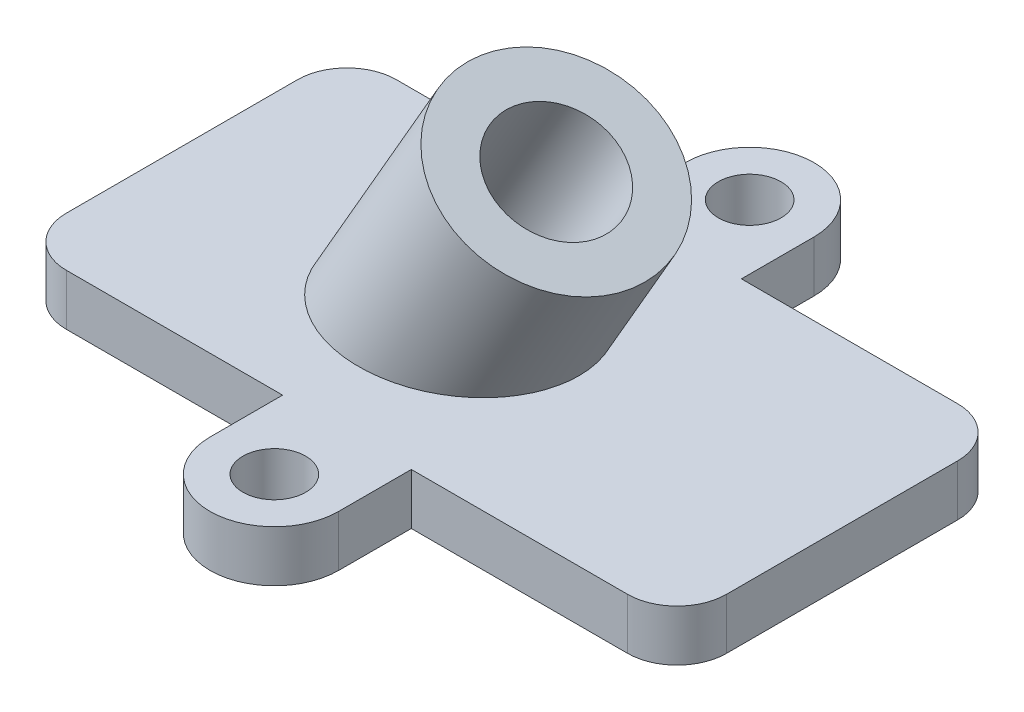
ISO-10303-21;
HEADER;
FILE_DESCRIPTION(('STEP AP214'),'2;1');
FILE_NAME('part.step','',(''),(''),'','','');
FILE_SCHEMA(('AUTOMOTIVE_DESIGN { 1 0 10303 214 1 1 1 1 }'));
ENDSEC;
DATA;
#1=APPLICATION_CONTEXT('core data for automotive mechanical design processes');
#2=APPLICATION_PROTOCOL_DEFINITION('international standard','automotive_design',2000,#1);
#3=PRODUCT_CONTEXT('',#1,'mechanical');
#4=PRODUCT('Part','Part','',(#3));
#5=PRODUCT_RELATED_PRODUCT_CATEGORY('part','',(#4));
#6=PRODUCT_DEFINITION_FORMATION('','',#4);
#7=PRODUCT_DEFINITION_CONTEXT('part definition',#1,'design');
#8=PRODUCT_DEFINITION('design','',#6,#7);
#9=PRODUCT_DEFINITION_SHAPE('','',#8);
#10=(LENGTH_UNIT() NAMED_UNIT(*) SI_UNIT(.MILLI.,.METRE.));
#11=(NAMED_UNIT(*) PLANE_ANGLE_UNIT() SI_UNIT($,.RADIAN.));
#12=(NAMED_UNIT(*) SI_UNIT($,.STERADIAN.) SOLID_ANGLE_UNIT());
#13=UNCERTAINTY_MEASURE_WITH_UNIT(LENGTH_MEASURE(1.E-05),#10,'distance_accuracy_value','');
#14=(GEOMETRIC_REPRESENTATION_CONTEXT(3) GLOBAL_UNCERTAINTY_ASSIGNED_CONTEXT((#13)) GLOBAL_UNIT_ASSIGNED_CONTEXT((#10,
#11,#12)) REPRESENTATION_CONTEXT('',''));
#15=CARTESIAN_POINT('',(0.,0.,0.));
#16=DIRECTION('',(0.,0.,1.));
#17=DIRECTION('',(1.,0.,0.));
#18=AXIS2_PLACEMENT_3D('',#15,#16,#17);
#19=CARTESIAN_POINT('',(-19.5,-15.5,50.));
#20=DIRECTION('',(-1.,0.,0.));
#21=DIRECTION('',(0.,0.,1.));
#22=AXIS2_PLACEMENT_3D('',#19,#20,#21);
#23=PLANE('',#22);
#24=DIRECTION('',(0.,0.,1.));
#25=VECTOR('',#24,1.);
#26=CARTESIAN_POINT('',(-19.5,0.,50.));
#27=LINE('',#26,#25);
#28=CARTESIAN_POINT('',(-19.5,0.,50.));
#29=VERTEX_POINT('',#28);
#30=CARTESIAN_POINT('',(-19.5,0.,72.));
#31=VERTEX_POINT('',#30);
#32=EDGE_CURVE('E179',#29,#31,#27,.T.);
#33=ORIENTED_EDGE('',*,*,#32,.F.);
#34=DIRECTION('',(0.,1.,0.));
#35=VECTOR('',#34,1.);
#36=CARTESIAN_POINT('',(-19.5,-15.5,50.));
#37=LINE('',#36,#35);
#38=CARTESIAN_POINT('',(-19.5,-15.5,50.));
#39=VERTEX_POINT('',#38);
#40=EDGE_CURVE('E41',#39,#29,#37,.T.);
#41=ORIENTED_EDGE('',*,*,#40,.F.);
#42=DIRECTION('',(0.,0.,1.));
#43=VECTOR('',#42,1.);
#44=CARTESIAN_POINT('',(-19.5,-15.5,50.));
#45=LINE('',#44,#43);
#46=CARTESIAN_POINT('',(-19.5,-15.5,72.));
#47=VERTEX_POINT('',#46);
#48=EDGE_CURVE('E225',#39,#47,#45,.T.);
#49=ORIENTED_EDGE('',*,*,#48,.T.);
#50=DIRECTION('',(0.,1.,0.));
#51=VECTOR('',#50,1.);
#52=CARTESIAN_POINT('',(-19.5,-15.5,72.));
#53=LINE('',#52,#51);
#54=EDGE_CURVE('E113',#47,#31,#53,.T.);
#55=ORIENTED_EDGE('',*,*,#54,.T.);
#56=EDGE_LOOP('',(#33,#41,#49,#55));
#57=FACE_BOUND('',#56,.T.);
#58=ADVANCED_FACE('F33',(#57),#23,.T.);
#59=CARTESIAN_POINT('',(-84.9999999999999,-15.5,50.));
#60=DIRECTION('',(0.,0.,1.));
#61=DIRECTION('',(1.,0.,0.));
#62=AXIS2_PLACEMENT_3D('',#59,#60,#61);
#63=PLANE('',#62);
#64=DIRECTION('',(1.,0.,0.));
#65=VECTOR('',#64,1.);
#66=CARTESIAN_POINT('',(-84.9999999999999,0.,50.));
#67=LINE('',#66,#65);
#68=CARTESIAN_POINT('',(-84.9999999999999,0.,50.));
#69=VERTEX_POINT('',#68);
#70=EDGE_CURVE('E222',#69,#29,#67,.T.);
#71=ORIENTED_EDGE('',*,*,#70,.F.);
#72=DIRECTION('',(0.,1.,0.));
#73=VECTOR('',#72,1.);
#74=CARTESIAN_POINT('',(-84.9999999999999,-15.5,50.));
#75=LINE('',#74,#73);
#76=CARTESIAN_POINT('',(-84.9999999999999,-15.5,50.));
#77=VERTEX_POINT('',#76);
#78=EDGE_CURVE('E101',#77,#69,#75,.T.);
#79=ORIENTED_EDGE('',*,*,#78,.F.);
#80=DIRECTION('',(1.,0.,0.));
#81=VECTOR('',#80,1.);
#82=CARTESIAN_POINT('',(-84.9999999999999,-15.5,50.));
#83=LINE('',#82,#81);
#84=EDGE_CURVE('E169',#77,#39,#83,.T.);
#85=ORIENTED_EDGE('',*,*,#84,.T.);
#86=ORIENTED_EDGE('',*,*,#40,.T.);
#87=EDGE_LOOP('',(#71,#79,#85,#86));
#88=FACE_BOUND('',#87,.T.);
#89=ADVANCED_FACE('F254',(#88),#63,.T.);
#90=CARTESIAN_POINT('',(-85.,-15.5,35.));
#91=DIRECTION('',(0.,1.,0.));
#92=DIRECTION('',(0.,0.,1.));
#93=AXIS2_PLACEMENT_3D('',#90,#91,#92);
#94=CYLINDRICAL_SURFACE('',#93,15.);
#95=CARTESIAN_POINT('',(-85.,0.,35.));
#96=DIRECTION('',(0.,1.,0.));
#97=DIRECTION('',(0.,0.,-1.));
#98=AXIS2_PLACEMENT_3D('',#95,#96,#97);
#99=CIRCLE('',#98,15.);
#100=CARTESIAN_POINT('',(-100.,0.,34.9999999999999));
#101=VERTEX_POINT('',#100);
#102=EDGE_CURVE('E156',#101,#69,#99,.T.);
#103=ORIENTED_EDGE('',*,*,#102,.F.);
#104=DIRECTION('',(0.,1.,0.));
#105=VECTOR('',#104,1.);
#106=CARTESIAN_POINT('',(-100.,-15.5,34.9999999999999));
#107=LINE('',#106,#105);
#108=CARTESIAN_POINT('',(-100.,-15.5,34.9999999999999));
#109=VERTEX_POINT('',#108);
#110=EDGE_CURVE('E151',#109,#101,#107,.T.);
#111=ORIENTED_EDGE('',*,*,#110,.F.);
#112=CARTESIAN_POINT('',(-85.,-15.5,35.));
#113=DIRECTION('',(0.,1.,0.));
#114=DIRECTION('',(0.,0.,-1.));
#115=AXIS2_PLACEMENT_3D('',#112,#113,#114);
#116=CIRCLE('',#115,15.);
#117=EDGE_CURVE('E154',#109,#77,#116,.T.);
#118=ORIENTED_EDGE('',*,*,#117,.T.);
#119=ORIENTED_EDGE('',*,*,#78,.T.);
#120=EDGE_LOOP('',(#103,#111,#118,#119));
#121=FACE_BOUND('',#120,.T.);
#122=ADVANCED_FACE('F153',(#121),#94,.T.);
#123=CARTESIAN_POINT('',(-100.,-15.5,34.9999999999999));
#124=DIRECTION('',(-1.,0.,0.));
#125=DIRECTION('',(0.,0.,1.));
#126=AXIS2_PLACEMENT_3D('',#123,#124,#125);
#127=PLANE('',#126);
#128=DIRECTION('',(0.,0.,1.));
#129=VECTOR('',#128,1.);
#130=CARTESIAN_POINT('',(-100.,0.,34.9999999999999));
#131=LINE('',#130,#129);
#132=CARTESIAN_POINT('',(-100.,0.,-34.9999999999999));
#133=VERTEX_POINT('',#132);
#134=EDGE_CURVE('E219',#133,#101,#131,.T.);
#135=ORIENTED_EDGE('',*,*,#134,.F.);
#136=DIRECTION('',(0.,1.,0.));
#137=VECTOR('',#136,1.);
#138=CARTESIAN_POINT('',(-100.,-15.5,-34.9999999999999));
#139=LINE('',#138,#137);
#140=CARTESIAN_POINT('',(-100.,-15.5,-34.9999999999999));
#141=VERTEX_POINT('',#140);
#142=EDGE_CURVE('E161',#141,#133,#139,.T.);
#143=ORIENTED_EDGE('',*,*,#142,.F.);
#144=DIRECTION('',(0.,0.,1.));
#145=VECTOR('',#144,1.);
#146=CARTESIAN_POINT('',(-100.,-15.5,34.9999999999999));
#147=LINE('',#146,#145);
#148=EDGE_CURVE('E167',#141,#109,#147,.T.);
#149=ORIENTED_EDGE('',*,*,#148,.T.);
#150=ORIENTED_EDGE('',*,*,#110,.T.);
#151=EDGE_LOOP('',(#135,#143,#149,#150));
#152=FACE_BOUND('',#151,.T.);
#153=ADVANCED_FACE('F171',(#152),#127,.T.);
#154=CARTESIAN_POINT('',(-85.,-15.5,-35.));
#155=DIRECTION('',(0.,1.,0.));
#156=DIRECTION('',(0.,0.,1.));
#157=AXIS2_PLACEMENT_3D('',#154,#155,#156);
#158=CYLINDRICAL_SURFACE('',#157,15.);
#159=CARTESIAN_POINT('',(-85.,0.,-35.));
#160=DIRECTION('',(0.,1.,0.));
#161=DIRECTION('',(0.,0.,-1.));
#162=AXIS2_PLACEMENT_3D('',#159,#160,#161);
#163=CIRCLE('',#162,15.);
#164=CARTESIAN_POINT('',(-85.,0.,-50.));
#165=VERTEX_POINT('',#164);
#166=EDGE_CURVE('E216',#165,#133,#163,.T.);
#167=ORIENTED_EDGE('',*,*,#166,.F.);
#168=DIRECTION('',(0.,1.,0.));
#169=VECTOR('',#168,1.);
#170=CARTESIAN_POINT('',(-85.,-15.5,-50.));
#171=LINE('',#170,#169);
#172=CARTESIAN_POINT('',(-85.,-15.5,-50.));
#173=VERTEX_POINT('',#172);
#174=EDGE_CURVE('E229',#173,#165,#171,.T.);
#175=ORIENTED_EDGE('',*,*,#174,.F.);
#176=CARTESIAN_POINT('',(-85.,-15.5,-35.));
#177=DIRECTION('',(0.,1.,0.));
#178=DIRECTION('',(0.,0.,-1.));
#179=AXIS2_PLACEMENT_3D('',#176,#177,#178);
#180=CIRCLE('',#179,15.);
#181=EDGE_CURVE('E172',#173,#141,#180,.T.);
#182=ORIENTED_EDGE('',*,*,#181,.T.);
#183=ORIENTED_EDGE('',*,*,#142,.T.);
#184=EDGE_LOOP('',(#167,#175,#182,#183));
#185=FACE_BOUND('',#184,.T.);
#186=ADVANCED_FACE('F267',(#185),#158,.T.);
#187=CARTESIAN_POINT('',(-84.9999999999999,-15.5,-50.));
#188=DIRECTION('',(0.,0.,-1.));
#189=DIRECTION('',(-1.,0.,0.));
#190=AXIS2_PLACEMENT_3D('',#187,#188,#189);
#191=PLANE('',#190);
#192=DIRECTION('',(-1.,0.,0.));
#193=VECTOR('',#192,1.);
#194=CARTESIAN_POINT('',(-84.9999999999999,0.,-50.));
#195=LINE('',#194,#193);
#196=CARTESIAN_POINT('',(-19.5,0.,-50.));
#197=VERTEX_POINT('',#196);
#198=EDGE_CURVE('E213',#197,#165,#195,.T.);
#199=ORIENTED_EDGE('',*,*,#198,.F.);
#200=DIRECTION('',(0.,1.,0.));
#201=VECTOR('',#200,1.);
#202=CARTESIAN_POINT('',(-19.5,-15.5,-50.));
#203=LINE('',#202,#201);
#204=CARTESIAN_POINT('',(-19.5,-15.5,-50.));
#205=VERTEX_POINT('',#204);
#206=EDGE_CURVE('E231',#205,#197,#203,.T.);
#207=ORIENTED_EDGE('',*,*,#206,.F.);
#208=DIRECTION('',(-1.,0.,0.));
#209=VECTOR('',#208,1.);
#210=CARTESIAN_POINT('',(-84.9999999999999,-15.5,-50.));
#211=LINE('',#210,#209);
#212=EDGE_CURVE('E174',#205,#173,#211,.T.);
#213=ORIENTED_EDGE('',*,*,#212,.T.);
#214=ORIENTED_EDGE('',*,*,#174,.T.);
#215=EDGE_LOOP('',(#199,#207,#213,#214));
#216=FACE_BOUND('',#215,.T.);
#217=ADVANCED_FACE('F270',(#216),#191,.T.);
#218=CARTESIAN_POINT('',(-19.5,-15.5,-50.));
#219=DIRECTION('',(-1.,0.,0.));
#220=DIRECTION('',(0.,0.,1.));
#221=AXIS2_PLACEMENT_3D('',#218,#219,#220);
#222=PLANE('',#221);
#223=DIRECTION('',(0.,0.,1.));
#224=VECTOR('',#223,1.);
#225=CARTESIAN_POINT('',(-19.5,0.,-50.));
#226=LINE('',#225,#224);
#227=CARTESIAN_POINT('',(-19.5,0.,-72.));
#228=VERTEX_POINT('',#227);
#229=EDGE_CURVE('E210',#228,#197,#226,.T.);
#230=ORIENTED_EDGE('',*,*,#229,.F.);
#231=DIRECTION('',(0.,1.,0.));
#232=VECTOR('',#231,1.);
#233=CARTESIAN_POINT('',(-19.5,-15.5,-72.));
#234=LINE('',#233,#232);
#235=CARTESIAN_POINT('',(-19.5,-15.5,-72.));
#236=VERTEX_POINT('',#235);
#237=EDGE_CURVE('E233',#236,#228,#234,.T.);
#238=ORIENTED_EDGE('',*,*,#237,.F.);
#239=DIRECTION('',(0.,0.,1.));
#240=VECTOR('',#239,1.);
#241=CARTESIAN_POINT('',(-19.5,-15.5,-50.));
#242=LINE('',#241,#240);
#243=EDGE_CURVE('E393',#236,#205,#242,.T.);
#244=ORIENTED_EDGE('',*,*,#243,.T.);
#245=ORIENTED_EDGE('',*,*,#206,.T.);
#246=EDGE_LOOP('',(#230,#238,#244,#245));
#247=FACE_BOUND('',#246,.T.);
#248=ADVANCED_FACE('F274',(#247),#222,.T.);
#249=CARTESIAN_POINT('',(0.,-15.5,-72.));
#250=DIRECTION('',(0.,1.,0.));
#251=DIRECTION('',(0.,0.,1.));
#252=AXIS2_PLACEMENT_3D('',#249,#250,#251);
#253=CYLINDRICAL_SURFACE('',#252,19.5);
#254=CARTESIAN_POINT('',(0.,0.,-72.));
#255=DIRECTION('',(0.,1.,0.));
#256=DIRECTION('',(0.,0.,-1.));
#257=AXIS2_PLACEMENT_3D('',#254,#255,#256);
#258=CIRCLE('',#257,19.5);
#259=CARTESIAN_POINT('',(19.5,0.,-72.));
#260=VERTEX_POINT('',#259);
#261=EDGE_CURVE('E207',#260,#228,#258,.T.);
#262=ORIENTED_EDGE('',*,*,#261,.F.);
#263=DIRECTION('',(0.,1.,0.));
#264=VECTOR('',#263,1.);
#265=CARTESIAN_POINT('',(19.5,-15.5,-72.));
#266=LINE('',#265,#264);
#267=CARTESIAN_POINT('',(19.5,-15.5,-72.));
#268=VERTEX_POINT('',#267);
#269=EDGE_CURVE('E235',#268,#260,#266,.T.);
#270=ORIENTED_EDGE('',*,*,#269,.F.);
#271=CARTESIAN_POINT('',(0.,-15.5,-72.));
#272=DIRECTION('',(0.,1.,0.));
#273=DIRECTION('',(0.,0.,-1.));
#274=AXIS2_PLACEMENT_3D('',#271,#272,#273);
#275=CIRCLE('',#274,19.5);
#276=EDGE_CURVE('E390',#268,#236,#275,.T.);
#277=ORIENTED_EDGE('',*,*,#276,.T.);
#278=ORIENTED_EDGE('',*,*,#237,.T.);
#279=EDGE_LOOP('',(#262,#270,#277,#278));
#280=FACE_BOUND('',#279,.T.);
#281=ADVANCED_FACE('F278',(#280),#253,.T.);
#282=CARTESIAN_POINT('',(19.5,-15.5,-72.));
#283=DIRECTION('',(1.,0.,0.));
#284=DIRECTION('',(0.,0.,-1.));
#285=AXIS2_PLACEMENT_3D('',#282,#283,#284);
#286=PLANE('',#285);
#287=DIRECTION('',(0.,0.,-1.));
#288=VECTOR('',#287,1.);
#289=CARTESIAN_POINT('',(19.5,0.,-72.));
#290=LINE('',#289,#288);
#291=CARTESIAN_POINT('',(19.5,0.,-50.));
#292=VERTEX_POINT('',#291);
#293=EDGE_CURVE('E204',#292,#260,#290,.T.);
#294=ORIENTED_EDGE('',*,*,#293,.F.);
#295=DIRECTION('',(0.,1.,0.));
#296=VECTOR('',#295,1.);
#297=CARTESIAN_POINT('',(19.5,-15.5,-50.));
#298=LINE('',#297,#296);
#299=CARTESIAN_POINT('',(19.5,-15.5,-50.));
#300=VERTEX_POINT('',#299);
#301=EDGE_CURVE('E237',#300,#292,#298,.T.);
#302=ORIENTED_EDGE('',*,*,#301,.F.);
#303=DIRECTION('',(0.,0.,-1.));
#304=VECTOR('',#303,1.);
#305=CARTESIAN_POINT('',(19.5,-15.5,-72.));
#306=LINE('',#305,#304);
#307=EDGE_CURVE('E387',#300,#268,#306,.T.);
#308=ORIENTED_EDGE('',*,*,#307,.T.);
#309=ORIENTED_EDGE('',*,*,#269,.T.);
#310=EDGE_LOOP('',(#294,#302,#308,#309));
#311=FACE_BOUND('',#310,.T.);
#312=ADVANCED_FACE('F282',(#311),#286,.T.);
#313=CARTESIAN_POINT('',(19.5,-15.5,-50.));
#314=DIRECTION('',(0.,0.,-1.));
#315=DIRECTION('',(-1.,0.,0.));
#316=AXIS2_PLACEMENT_3D('',#313,#314,#315);
#317=PLANE('',#316);
#318=DIRECTION('',(-1.,0.,0.));
#319=VECTOR('',#318,1.);
#320=CARTESIAN_POINT('',(19.5,0.,-50.));
#321=LINE('',#320,#319);
#322=CARTESIAN_POINT('',(84.9999999999999,0.,-50.));
#323=VERTEX_POINT('',#322);
#324=EDGE_CURVE('E201',#323,#292,#321,.T.);
#325=ORIENTED_EDGE('',*,*,#324,.F.);
#326=DIRECTION('',(0.,1.,0.));
#327=VECTOR('',#326,1.);
#328=CARTESIAN_POINT('',(84.9999999999999,-15.5,-50.));
#329=LINE('',#328,#327);
#330=CARTESIAN_POINT('',(84.9999999999999,-15.5,-50.));
#331=VERTEX_POINT('',#330);
#332=EDGE_CURVE('E239',#331,#323,#329,.T.);
#333=ORIENTED_EDGE('',*,*,#332,.F.);
#334=DIRECTION('',(-1.,0.,0.));
#335=VECTOR('',#334,1.);
#336=CARTESIAN_POINT('',(19.5,-15.5,-50.));
#337=LINE('',#336,#335);
#338=EDGE_CURVE('E384',#331,#300,#337,.T.);
#339=ORIENTED_EDGE('',*,*,#338,.T.);
#340=ORIENTED_EDGE('',*,*,#301,.T.);
#341=EDGE_LOOP('',(#325,#333,#339,#340));
#342=FACE_BOUND('',#341,.T.);
#343=ADVANCED_FACE('F286',(#342),#317,.T.);
#344=CARTESIAN_POINT('',(85.,-15.5,-35.));
#345=DIRECTION('',(0.,1.,0.));
#346=DIRECTION('',(0.,0.,1.));
#347=AXIS2_PLACEMENT_3D('',#344,#345,#346);
#348=CYLINDRICAL_SURFACE('',#347,15.);
#349=CARTESIAN_POINT('',(85.,0.,-35.));
#350=DIRECTION('',(0.,1.,0.));
#351=DIRECTION('',(0.,0.,-1.));
#352=AXIS2_PLACEMENT_3D('',#349,#350,#351);
#353=CIRCLE('',#352,15.);
#354=CARTESIAN_POINT('',(100.,0.,-34.9999999999999));
#355=VERTEX_POINT('',#354);
#356=EDGE_CURVE('E198',#355,#323,#353,.T.);
#357=ORIENTED_EDGE('',*,*,#356,.F.);
#358=DIRECTION('',(0.,1.,0.));
#359=VECTOR('',#358,1.);
#360=CARTESIAN_POINT('',(100.,-15.5,-34.9999999999999));
#361=LINE('',#360,#359);
#362=CARTESIAN_POINT('',(100.,-15.5,-34.9999999999999));
#363=VERTEX_POINT('',#362);
#364=EDGE_CURVE('E241',#363,#355,#361,.T.);
#365=ORIENTED_EDGE('',*,*,#364,.F.);
#366=CARTESIAN_POINT('',(85.,-15.5,-35.));
#367=DIRECTION('',(0.,1.,0.));
#368=DIRECTION('',(0.,0.,-1.));
#369=AXIS2_PLACEMENT_3D('',#366,#367,#368);
#370=CIRCLE('',#369,15.);
#371=EDGE_CURVE('E381',#363,#331,#370,.T.);
#372=ORIENTED_EDGE('',*,*,#371,.T.);
#373=ORIENTED_EDGE('',*,*,#332,.T.);
#374=EDGE_LOOP('',(#357,#365,#372,#373));
#375=FACE_BOUND('',#374,.T.);
#376=ADVANCED_FACE('F290',(#375),#348,.T.);
#377=CARTESIAN_POINT('',(100.,-15.5,34.9999999999999));
#378=DIRECTION('',(1.,0.,0.));
#379=DIRECTION('',(0.,0.,-1.));
#380=AXIS2_PLACEMENT_3D('',#377,#378,#379);
#381=PLANE('',#380);
#382=DIRECTION('',(0.,0.,-1.));
#383=VECTOR('',#382,1.);
#384=CARTESIAN_POINT('',(100.,0.,34.9999999999999));
#385=LINE('',#384,#383);
#386=CARTESIAN_POINT('',(100.,0.,34.9999999999999));
#387=VERTEX_POINT('',#386);
#388=EDGE_CURVE('E195',#387,#355,#385,.T.);
#389=ORIENTED_EDGE('',*,*,#388,.F.);
#390=DIRECTION('',(0.,1.,0.));
#391=VECTOR('',#390,1.);
#392=CARTESIAN_POINT('',(100.,-15.5,34.9999999999999));
#393=LINE('',#392,#391);
#394=CARTESIAN_POINT('',(100.,-15.5,34.9999999999999));
#395=VERTEX_POINT('',#394);
#396=EDGE_CURVE('E243',#395,#387,#393,.T.);
#397=ORIENTED_EDGE('',*,*,#396,.F.);
#398=DIRECTION('',(0.,0.,-1.));
#399=VECTOR('',#398,1.);
#400=CARTESIAN_POINT('',(100.,-15.5,34.9999999999999));
#401=LINE('',#400,#399);
#402=EDGE_CURVE('E378',#395,#363,#401,.T.);
#403=ORIENTED_EDGE('',*,*,#402,.T.);
#404=ORIENTED_EDGE('',*,*,#364,.T.);
#405=EDGE_LOOP('',(#389,#397,#403,#404));
#406=FACE_BOUND('',#405,.T.);
#407=ADVANCED_FACE('F294',(#406),#381,.T.);
#408=CARTESIAN_POINT('',(85.,-15.5,35.));
#409=DIRECTION('',(0.,1.,0.));
#410=DIRECTION('',(0.,0.,1.));
#411=AXIS2_PLACEMENT_3D('',#408,#409,#410);
#412=CYLINDRICAL_SURFACE('',#411,15.);
#413=CARTESIAN_POINT('',(85.,0.,35.));
#414=DIRECTION('',(0.,1.,0.));
#415=DIRECTION('',(0.,0.,1.));
#416=AXIS2_PLACEMENT_3D('',#413,#414,#415);
#417=CIRCLE('',#416,15.);
#418=CARTESIAN_POINT('',(84.9999999999999,0.,50.));
#419=VERTEX_POINT('',#418);
#420=EDGE_CURVE('E192',#419,#387,#417,.T.);
#421=ORIENTED_EDGE('',*,*,#420,.F.);
#422=DIRECTION('',(0.,1.,0.));
#423=VECTOR('',#422,1.);
#424=CARTESIAN_POINT('',(84.9999999999999,-15.5,50.));
#425=LINE('',#424,#423);
#426=CARTESIAN_POINT('',(84.9999999999999,-15.5,50.));
#427=VERTEX_POINT('',#426);
#428=EDGE_CURVE('E245',#427,#419,#425,.T.);
#429=ORIENTED_EDGE('',*,*,#428,.F.);
#430=CARTESIAN_POINT('',(85.,-15.5,35.));
#431=DIRECTION('',(0.,1.,0.));
#432=DIRECTION('',(0.,0.,1.));
#433=AXIS2_PLACEMENT_3D('',#430,#431,#432);
#434=CIRCLE('',#433,15.);
#435=EDGE_CURVE('E375',#427,#395,#434,.T.);
#436=ORIENTED_EDGE('',*,*,#435,.T.);
#437=ORIENTED_EDGE('',*,*,#396,.T.);
#438=EDGE_LOOP('',(#421,#429,#436,#437));
#439=FACE_BOUND('',#438,.T.);
#440=ADVANCED_FACE('F298',(#439),#412,.T.);
#441=CARTESIAN_POINT('',(19.5,-15.5,50.));
#442=DIRECTION('',(0.,0.,1.));
#443=DIRECTION('',(1.,0.,0.));
#444=AXIS2_PLACEMENT_3D('',#441,#442,#443);
#445=PLANE('',#444);
#446=DIRECTION('',(1.,0.,0.));
#447=VECTOR('',#446,1.);
#448=CARTESIAN_POINT('',(19.5,0.,50.));
#449=LINE('',#448,#447);
#450=CARTESIAN_POINT('',(19.5,0.,50.));
#451=VERTEX_POINT('',#450);
#452=EDGE_CURVE('E189',#451,#419,#449,.T.);
#453=ORIENTED_EDGE('',*,*,#452,.F.);
#454=DIRECTION('',(0.,1.,0.));
#455=VECTOR('',#454,1.);
#456=CARTESIAN_POINT('',(19.5,-15.5,50.));
#457=LINE('',#456,#455);
#458=CARTESIAN_POINT('',(19.5,-15.5,50.));
#459=VERTEX_POINT('',#458);
#460=EDGE_CURVE('E247',#459,#451,#457,.T.);
#461=ORIENTED_EDGE('',*,*,#460,.F.);
#462=DIRECTION('',(1.,0.,0.));
#463=VECTOR('',#462,1.);
#464=CARTESIAN_POINT('',(19.5,-15.5,50.));
#465=LINE('',#464,#463);
#466=EDGE_CURVE('E372',#459,#427,#465,.T.);
#467=ORIENTED_EDGE('',*,*,#466,.T.);
#468=ORIENTED_EDGE('',*,*,#428,.T.);
#469=EDGE_LOOP('',(#453,#461,#467,#468));
#470=FACE_BOUND('',#469,.T.);
#471=ADVANCED_FACE('F302',(#470),#445,.T.);
#472=CARTESIAN_POINT('',(19.5,-15.5,72.));
#473=DIRECTION('',(1.,0.,0.));
#474=DIRECTION('',(0.,0.,-1.));
#475=AXIS2_PLACEMENT_3D('',#472,#473,#474);
#476=PLANE('',#475);
#477=DIRECTION('',(0.,0.,-1.));
#478=VECTOR('',#477,1.);
#479=CARTESIAN_POINT('',(19.5,0.,72.));
#480=LINE('',#479,#478);
#481=CARTESIAN_POINT('',(19.5,0.,72.));
#482=VERTEX_POINT('',#481);
#483=EDGE_CURVE('E186',#482,#451,#480,.T.);
#484=ORIENTED_EDGE('',*,*,#483,.F.);
#485=DIRECTION('',(0.,1.,0.));
#486=VECTOR('',#485,1.);
#487=CARTESIAN_POINT('',(19.5,-15.5,72.));
#488=LINE('',#487,#486);
#489=CARTESIAN_POINT('',(19.5,-15.5,72.));
#490=VERTEX_POINT('',#489);
#491=EDGE_CURVE('E249',#490,#482,#488,.T.);
#492=ORIENTED_EDGE('',*,*,#491,.F.);
#493=DIRECTION('',(0.,0.,-1.));
#494=VECTOR('',#493,1.);
#495=CARTESIAN_POINT('',(19.5,-15.5,72.));
#496=LINE('',#495,#494);
#497=EDGE_CURVE('E369',#490,#459,#496,.T.);
#498=ORIENTED_EDGE('',*,*,#497,.T.);
#499=ORIENTED_EDGE('',*,*,#460,.T.);
#500=EDGE_LOOP('',(#484,#492,#498,#499));
#501=FACE_BOUND('',#500,.T.);
#502=ADVANCED_FACE('F306',(#501),#476,.T.);
#503=CARTESIAN_POINT('',(0.,-15.5,72.));
#504=DIRECTION('',(0.,1.,0.));
#505=DIRECTION('',(0.,0.,1.));
#506=AXIS2_PLACEMENT_3D('',#503,#504,#505);
#507=CYLINDRICAL_SURFACE('',#506,19.5);
#508=CARTESIAN_POINT('',(0.,0.,72.));
#509=DIRECTION('',(0.,1.,0.));
#510=DIRECTION('',(0.,0.,1.));
#511=AXIS2_PLACEMENT_3D('',#508,#509,#510);
#512=CIRCLE('',#511,19.5);
#513=EDGE_CURVE('E182',#31,#482,#512,.T.);
#514=ORIENTED_EDGE('',*,*,#513,.F.);
#515=ORIENTED_EDGE('',*,*,#54,.F.);
#516=CARTESIAN_POINT('',(0.,-15.5,72.));
#517=DIRECTION('',(0.,1.,0.));
#518=DIRECTION('',(0.,0.,1.));
#519=AXIS2_PLACEMENT_3D('',#516,#517,#518);
#520=CIRCLE('',#519,19.5);
#521=EDGE_CURVE('E367',#47,#490,#520,.T.);
#522=ORIENTED_EDGE('',*,*,#521,.T.);
#523=ORIENTED_EDGE('',*,*,#491,.T.);
#524=EDGE_LOOP('',(#514,#515,#522,#523));
#525=FACE_BOUND('',#524,.T.);
#526=ADVANCED_FACE('F250',(#525),#507,.T.);
#527=CARTESIAN_POINT('',(0.,-15.5,72.));
#528=DIRECTION('',(0.,1.,0.));
#529=DIRECTION('',(0.,0.,1.));
#530=AXIS2_PLACEMENT_3D('',#527,#528,#529);
#531=PLANE('',#530);
#532=CARTESIAN_POINT('',(-24.4189830103644,-15.5,0.));
#533=DIRECTION('',(0.,1.,0.));
#534=DIRECTION('',(1.,0.,0.));
#535=AXIS2_PLACEMENT_3D('',#532,#533,#534);
#536=ELLIPSE('',#535,20.2072594216369,17.5);
#537=CARTESIAN_POINT('',(-4.21172358872751,-15.5,0.));
#538=VERTEX_POINT('',#537);
#539=EDGE_CURVE('E348',#538,#538,#536,.F.);
#540=ORIENTED_EDGE('',*,*,#539,.F.);
#541=EDGE_LOOP('',(#540));
#542=FACE_BOUND('',#541,.T.);
#543=CARTESIAN_POINT('',(0.,-15.5,-72.));
#544=DIRECTION('',(0.,1.,0.));
#545=DIRECTION('',(0.,0.,-1.));
#546=AXIS2_PLACEMENT_3D('',#543,#544,#545);
#547=CIRCLE('',#546,9.5);
#548=CARTESIAN_POINT('',(0.,-15.5,-81.5));
#549=VERTEX_POINT('',#548);
#550=EDGE_CURVE('E356',#549,#549,#547,.T.);
#551=ORIENTED_EDGE('',*,*,#550,.T.);
#552=EDGE_LOOP('',(#551));
#553=FACE_BOUND('',#552,.T.);
#554=CARTESIAN_POINT('',(0.,-15.5,72.));
#555=DIRECTION('',(0.,1.,0.));
#556=DIRECTION('',(0.,0.,1.));
#557=AXIS2_PLACEMENT_3D('',#554,#555,#556);
#558=CIRCLE('',#557,9.5);
#559=CARTESIAN_POINT('',(0.,-15.5,81.5));
#560=VERTEX_POINT('',#559);
#561=EDGE_CURVE('E183',#560,#560,#558,.T.);
#562=ORIENTED_EDGE('',*,*,#561,.T.);
#563=EDGE_LOOP('',(#562));
#564=FACE_BOUND('',#563,.T.);
#565=ORIENTED_EDGE('',*,*,#48,.F.);
#566=ORIENTED_EDGE('',*,*,#84,.F.);
#567=ORIENTED_EDGE('',*,*,#117,.F.);
#568=ORIENTED_EDGE('',*,*,#148,.F.);
#569=ORIENTED_EDGE('',*,*,#181,.F.);
#570=ORIENTED_EDGE('',*,*,#212,.F.);
#571=ORIENTED_EDGE('',*,*,#243,.F.);
#572=ORIENTED_EDGE('',*,*,#276,.F.);
#573=ORIENTED_EDGE('',*,*,#307,.F.);
#574=ORIENTED_EDGE('',*,*,#338,.F.);
#575=ORIENTED_EDGE('',*,*,#371,.F.);
#576=ORIENTED_EDGE('',*,*,#402,.F.);
#577=ORIENTED_EDGE('',*,*,#435,.F.);
#578=ORIENTED_EDGE('',*,*,#466,.F.);
#579=ORIENTED_EDGE('',*,*,#497,.F.);
#580=ORIENTED_EDGE('',*,*,#521,.F.);
#581=EDGE_LOOP('',(#565,#566,#567,#568,#569,#570,#571,#572,#573,#574,#575,#576,#577,#578,#579,#580));
#582=FACE_BOUND('',#581,.T.);
#583=ADVANCED_FACE('F165',(#542,#553,#564,#582),#531,.F.);
#584=CARTESIAN_POINT('',(0.,0.,72.));
#585=DIRECTION('',(0.,1.,0.));
#586=DIRECTION('',(0.,0.,1.));
#587=AXIS2_PLACEMENT_3D('',#584,#585,#586);
#588=PLANE('',#587);
#589=CARTESIAN_POINT('',(-15.4700538379252,0.,0.));
#590=DIRECTION('',(0.,1.,0.));
#591=DIRECTION('',(1.,0.,0.));
#592=AXIS2_PLACEMENT_3D('',#589,#590,#591);
#593=ELLIPSE('',#592,35.7957166897568,31.);
#594=CARTESIAN_POINT('',(20.3256628518316,0.,0.));
#595=VERTEX_POINT('',#594);
#596=EDGE_CURVE('E11',#595,#595,#593,.T.);
#597=ORIENTED_EDGE('',*,*,#596,.F.);
#598=EDGE_LOOP('',(#597));
#599=FACE_BOUND('',#598,.T.);
#600=CARTESIAN_POINT('',(0.,0.,-72.));
#601=DIRECTION('',(0.,1.,0.));
#602=DIRECTION('',(0.,0.,-1.));
#603=AXIS2_PLACEMENT_3D('',#600,#601,#602);
#604=CIRCLE('',#603,9.5);
#605=CARTESIAN_POINT('',(0.,0.,-81.5));
#606=VERTEX_POINT('',#605);
#607=EDGE_CURVE('E352',#606,#606,#604,.T.);
#608=ORIENTED_EDGE('',*,*,#607,.F.);
#609=EDGE_LOOP('',(#608));
#610=FACE_BOUND('',#609,.T.);
#611=CARTESIAN_POINT('',(0.,0.,72.));
#612=DIRECTION('',(0.,1.,0.));
#613=DIRECTION('',(0.,0.,1.));
#614=AXIS2_PLACEMENT_3D('',#611,#612,#613);
#615=CIRCLE('',#614,9.5);
#616=CARTESIAN_POINT('',(0.,0.,81.5));
#617=VERTEX_POINT('',#616);
#618=EDGE_CURVE('E359',#617,#617,#615,.T.);
#619=ORIENTED_EDGE('',*,*,#618,.F.);
#620=EDGE_LOOP('',(#619));
#621=FACE_BOUND('',#620,.T.);
#622=ORIENTED_EDGE('',*,*,#32,.T.);
#623=ORIENTED_EDGE('',*,*,#513,.T.);
#624=ORIENTED_EDGE('',*,*,#483,.T.);
#625=ORIENTED_EDGE('',*,*,#452,.T.);
#626=ORIENTED_EDGE('',*,*,#420,.T.);
#627=ORIENTED_EDGE('',*,*,#388,.T.);
#628=ORIENTED_EDGE('',*,*,#356,.T.);
#629=ORIENTED_EDGE('',*,*,#324,.T.);
#630=ORIENTED_EDGE('',*,*,#293,.T.);
#631=ORIENTED_EDGE('',*,*,#261,.T.);
#632=ORIENTED_EDGE('',*,*,#229,.T.);
#633=ORIENTED_EDGE('',*,*,#198,.T.);
#634=ORIENTED_EDGE('',*,*,#166,.T.);
#635=ORIENTED_EDGE('',*,*,#134,.T.);
#636=ORIENTED_EDGE('',*,*,#102,.T.);
#637=ORIENTED_EDGE('',*,*,#70,.T.);
#638=EDGE_LOOP('',(#622,#623,#624,#625,#626,#627,#628,#629,#630,#631,#632,#633,#634,#635,#636,#637));
#639=FACE_BOUND('',#638,.T.);
#640=ADVANCED_FACE('F253',(#599,#610,#621,#639),#588,.T.);
#641=CARTESIAN_POINT('',(0.,-15.5,72.));
#642=DIRECTION('',(0.,1.,0.));
#643=DIRECTION('',(0.,0.,1.));
#644=AXIS2_PLACEMENT_3D('',#641,#642,#643);
#645=CYLINDRICAL_SURFACE('',#644,9.5);
#646=ORIENTED_EDGE('',*,*,#561,.F.);
#647=EDGE_LOOP('',(#646));
#648=FACE_BOUND('',#647,.T.);
#649=ORIENTED_EDGE('',*,*,#618,.T.);
#650=EDGE_LOOP('',(#649));
#651=FACE_BOUND('',#650,.T.);
#652=ADVANCED_FACE('F318',(#648,#651),#645,.F.);
#653=CARTESIAN_POINT('',(0.,-15.5,-72.));
#654=DIRECTION('',(0.,1.,0.));
#655=DIRECTION('',(0.,0.,1.));
#656=AXIS2_PLACEMENT_3D('',#653,#654,#655);
#657=CYLINDRICAL_SURFACE('',#656,9.5);
#658=ORIENTED_EDGE('',*,*,#550,.F.);
#659=EDGE_LOOP('',(#658));
#660=FACE_BOUND('',#659,.T.);
#661=ORIENTED_EDGE('',*,*,#607,.T.);
#662=EDGE_LOOP('',(#661));
#663=FACE_BOUND('',#662,.T.);
#664=ADVANCED_FACE('F325',(#660,#663),#657,.F.);
#665=CARTESIAN_POINT('',(-62.7017580634678,-81.8077114467052,0.));
#666=DIRECTION('',(0.500000000000001,0.866025403784438,0.));
#667=DIRECTION('',(-0.866025403784438,0.500000000000001,0.));
#668=AXIS2_PLACEMENT_3D('',#665,#666,#667);
#669=CYLINDRICAL_SURFACE('',#668,31.);
#670=ORIENTED_EDGE('',*,*,#596,.T.);
#671=EDGE_LOOP('',(#670));
#672=FACE_BOUND('',#671,.T.);
#673=CARTESIAN_POINT('',(13.3974596215562,50.0000000000001,0.));
#674=DIRECTION('',(0.500000000000001,0.866025403784438,0.));
#675=DIRECTION('',(-0.866025403784438,0.500000000000001,0.));
#676=AXIS2_PLACEMENT_3D('',#673,#674,#675);
#677=CIRCLE('',#676,31.);
#678=CARTESIAN_POINT('',(-13.4493278957614,65.5000000000001,0.));
#679=VERTEX_POINT('',#678);
#680=EDGE_CURVE('E349',#679,#679,#677,.T.);
#681=ORIENTED_EDGE('',*,*,#680,.F.);
#682=EDGE_LOOP('',(#681));
#683=FACE_BOUND('',#682,.T.);
#684=ADVANCED_FACE('F329',(#672,#683),#669,.T.);
#685=CARTESIAN_POINT('',(13.3974596215562,50.0000000000001,0.));
#686=DIRECTION('',(0.500000000000001,0.866025403784438,0.));
#687=DIRECTION('',(-0.866025403784438,0.500000000000001,0.));
#688=AXIS2_PLACEMENT_3D('',#685,#686,#687);
#689=PLANE('',#688);
#690=CARTESIAN_POINT('',(13.3974596215562,50.0000000000001,0.));
#691=DIRECTION('',(0.500000000000001,0.866025403784438,0.));
#692=DIRECTION('',(-0.866025403784438,0.500000000000001,0.));
#693=AXIS2_PLACEMENT_3D('',#690,#691,#692);
#694=CIRCLE('',#693,17.5);
#695=CARTESIAN_POINT('',(-1.75798494467147,58.7500000000001,0.));
#696=VERTEX_POINT('',#695);
#697=EDGE_CURVE('E346',#696,#696,#694,.T.);
#698=ORIENTED_EDGE('',*,*,#697,.F.);
#699=EDGE_LOOP('',(#698));
#700=FACE_BOUND('',#699,.T.);
#701=ORIENTED_EDGE('',*,*,#680,.T.);
#702=EDGE_LOOP('',(#701));
#703=FACE_BOUND('',#702,.T.);
#704=ADVANCED_FACE('F333',(#700,#703),#689,.T.);
#705=CARTESIAN_POINT('',(-43.3149202704753,-48.2287233911458,0.));
#706=DIRECTION('',(0.500000000000001,0.866025403784438,0.));
#707=DIRECTION('',(-0.866025403784438,0.500000000000001,0.));
#708=AXIS2_PLACEMENT_3D('',#705,#706,#707);
#709=CYLINDRICAL_SURFACE('',#708,17.5);
#710=ORIENTED_EDGE('',*,*,#697,.T.);
#711=EDGE_LOOP('',(#710));
#712=FACE_BOUND('',#711,.T.);
#713=ORIENTED_EDGE('',*,*,#539,.T.);
#714=EDGE_LOOP('',(#713));
#715=FACE_BOUND('',#714,.T.);
#716=ADVANCED_FACE('F337',(#712,#715),#709,.F.);
#717=CLOSED_SHELL('',(#58,#89,#122,#153,#186,#217,#248,#281,#312,#343,#376,#407,#440,#471,#502,
#526,#583,#640,#652,#664,#684,#704,#716));
#718=MANIFOLD_SOLID_BREP('B2',#717);
#719=ADVANCED_BREP_SHAPE_REPRESENTATION('',(#18,#718),#14);
#720=SHAPE_DEFINITION_REPRESENTATION(#9,#719);
ENDSEC;
END-ISO-10303-21;
